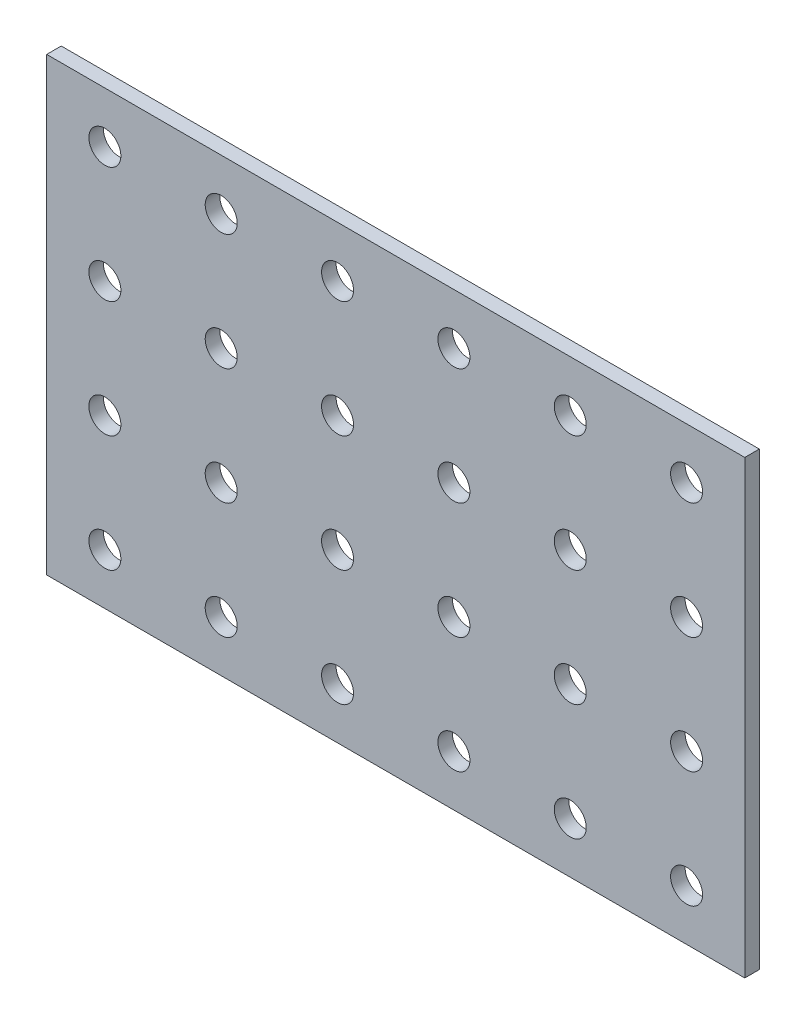
ISO-10303-21;
HEADER;
FILE_DESCRIPTION(('STEP AP214'),'2;1');
FILE_NAME('part.step','',(''),(''),'','','');
FILE_SCHEMA(('AUTOMOTIVE_DESIGN { 1 0 10303 214 1 1 1 1 }'));
ENDSEC;
DATA;
#1=APPLICATION_CONTEXT('core data for automotive mechanical design processes');
#2=APPLICATION_PROTOCOL_DEFINITION('international standard','automotive_design',2000,#1);
#3=PRODUCT_CONTEXT('',#1,'mechanical');
#4=PRODUCT('Part','Part','',(#3));
#5=PRODUCT_RELATED_PRODUCT_CATEGORY('part','',(#4));
#6=PRODUCT_DEFINITION_FORMATION('','',#4);
#7=PRODUCT_DEFINITION_CONTEXT('part definition',#1,'design');
#8=PRODUCT_DEFINITION('design','',#6,#7);
#9=PRODUCT_DEFINITION_SHAPE('','',#8);
#10=(LENGTH_UNIT() NAMED_UNIT(*) SI_UNIT(.MILLI.,.METRE.));
#11=(NAMED_UNIT(*) PLANE_ANGLE_UNIT() SI_UNIT($,.RADIAN.));
#12=(NAMED_UNIT(*) SI_UNIT($,.STERADIAN.) SOLID_ANGLE_UNIT());
#13=UNCERTAINTY_MEASURE_WITH_UNIT(LENGTH_MEASURE(1.E-05),#10,'distance_accuracy_value','');
#14=(GEOMETRIC_REPRESENTATION_CONTEXT(3) GLOBAL_UNCERTAINTY_ASSIGNED_CONTEXT((#13)) GLOBAL_UNIT_ASSIGNED_CONTEXT((#10,
#11,#12)) REPRESENTATION_CONTEXT('',''));
#15=CARTESIAN_POINT('',(0.,0.,0.));
#16=DIRECTION('',(0.,0.,1.));
#17=DIRECTION('',(1.,0.,0.));
#18=AXIS2_PLACEMENT_3D('',#15,#16,#17);
#19=CARTESIAN_POINT('',(0.,0.,10.));
#20=DIRECTION('',(1.,0.,0.));
#21=DIRECTION('',(0.,0.,-1.));
#22=AXIS2_PLACEMENT_3D('',#19,#20,#21);
#23=PLANE('',#22);
#24=DIRECTION('',(0.,-1.,0.));
#25=VECTOR('',#24,1.);
#26=CARTESIAN_POINT('',(0.,0.,0.));
#27=LINE('',#26,#25);
#28=CARTESIAN_POINT('',(0.,310.,0.));
#29=VERTEX_POINT('',#28);
#30=CARTESIAN_POINT('',(0.,0.,0.));
#31=VERTEX_POINT('',#30);
#32=EDGE_CURVE('E103',#29,#31,#27,.T.);
#33=ORIENTED_EDGE('',*,*,#32,.T.);
#34=DIRECTION('',(0.,0.,-1.));
#35=VECTOR('',#34,1.);
#36=CARTESIAN_POINT('',(0.,0.,10.));
#37=LINE('',#36,#35);
#38=CARTESIAN_POINT('',(0.,0.,10.));
#39=VERTEX_POINT('',#38);
#40=EDGE_CURVE('E94',#39,#31,#37,.T.);
#41=ORIENTED_EDGE('',*,*,#40,.F.);
#42=DIRECTION('',(0.,-1.,0.));
#43=VECTOR('',#42,1.);
#44=CARTESIAN_POINT('',(0.,0.,10.));
#45=LINE('',#44,#43);
#46=CARTESIAN_POINT('',(0.,310.,10.));
#47=VERTEX_POINT('',#46);
#48=EDGE_CURVE('E88',#47,#39,#45,.T.);
#49=ORIENTED_EDGE('',*,*,#48,.F.);
#50=DIRECTION('',(0.,0.,-1.));
#51=VECTOR('',#50,1.);
#52=CARTESIAN_POINT('',(0.,310.,10.));
#53=LINE('',#52,#51);
#54=EDGE_CURVE('E99',#47,#29,#53,.T.);
#55=ORIENTED_EDGE('',*,*,#54,.T.);
#56=EDGE_LOOP('',(#33,#41,#49,#55));
#57=FACE_BOUND('',#56,.T.);
#58=ADVANCED_FACE('F34',(#57),#23,.F.);
#59=CARTESIAN_POINT('',(0.,0.,10.));
#60=DIRECTION('',(0.,1.,0.));
#61=DIRECTION('',(0.,0.,1.));
#62=AXIS2_PLACEMENT_3D('',#59,#60,#61);
#63=PLANE('',#62);
#64=DIRECTION('',(1.,0.,0.));
#65=VECTOR('',#64,1.);
#66=CARTESIAN_POINT('',(0.,0.,0.));
#67=LINE('',#66,#65);
#68=CARTESIAN_POINT('',(480.,0.,0.));
#69=VERTEX_POINT('',#68);
#70=EDGE_CURVE('E93',#31,#69,#67,.T.);
#71=ORIENTED_EDGE('',*,*,#70,.T.);
#72=DIRECTION('',(0.,0.,-1.));
#73=VECTOR('',#72,1.);
#74=CARTESIAN_POINT('',(480.,0.,10.));
#75=LINE('',#74,#73);
#76=CARTESIAN_POINT('',(480.,0.,10.));
#77=VERTEX_POINT('',#76);
#78=EDGE_CURVE('E91',#77,#69,#75,.T.);
#79=ORIENTED_EDGE('',*,*,#78,.F.);
#80=DIRECTION('',(1.,0.,0.));
#81=VECTOR('',#80,1.);
#82=CARTESIAN_POINT('',(0.,0.,10.));
#83=LINE('',#82,#81);
#84=EDGE_CURVE('E82',#39,#77,#83,.T.);
#85=ORIENTED_EDGE('',*,*,#84,.F.);
#86=ORIENTED_EDGE('',*,*,#40,.T.);
#87=EDGE_LOOP('',(#71,#79,#85,#86));
#88=FACE_BOUND('',#87,.T.);
#89=ADVANCED_FACE('F92',(#88),#63,.F.);
#90=CARTESIAN_POINT('',(480.,0.,10.));
#91=DIRECTION('',(-1.,0.,0.));
#92=DIRECTION('',(0.,0.,1.));
#93=AXIS2_PLACEMENT_3D('',#90,#91,#92);
#94=PLANE('',#93);
#95=DIRECTION('',(0.,1.,0.));
#96=VECTOR('',#95,1.);
#97=CARTESIAN_POINT('',(480.,0.,0.));
#98=LINE('',#97,#96);
#99=CARTESIAN_POINT('',(480.,310.,0.));
#100=VERTEX_POINT('',#99);
#101=EDGE_CURVE('E68',#69,#100,#98,.T.);
#102=ORIENTED_EDGE('',*,*,#101,.T.);
#103=DIRECTION('',(0.,0.,-1.));
#104=VECTOR('',#103,1.);
#105=CARTESIAN_POINT('',(480.,310.,10.));
#106=LINE('',#105,#104);
#107=CARTESIAN_POINT('',(480.,310.,10.));
#108=VERTEX_POINT('',#107);
#109=EDGE_CURVE('E95',#108,#100,#106,.T.);
#110=ORIENTED_EDGE('',*,*,#109,.F.);
#111=DIRECTION('',(0.,1.,0.));
#112=VECTOR('',#111,1.);
#113=CARTESIAN_POINT('',(480.,0.,10.));
#114=LINE('',#113,#112);
#115=EDGE_CURVE('E86',#77,#108,#114,.T.);
#116=ORIENTED_EDGE('',*,*,#115,.F.);
#117=ORIENTED_EDGE('',*,*,#78,.T.);
#118=EDGE_LOOP('',(#102,#110,#116,#117));
#119=FACE_BOUND('',#118,.T.);
#120=ADVANCED_FACE('F97',(#119),#94,.F.);
#121=CARTESIAN_POINT('',(0.,310.,10.));
#122=DIRECTION('',(0.,-1.,0.));
#123=DIRECTION('',(0.,0.,-1.));
#124=AXIS2_PLACEMENT_3D('',#121,#122,#123);
#125=PLANE('',#124);
#126=DIRECTION('',(-1.,0.,0.));
#127=VECTOR('',#126,1.);
#128=CARTESIAN_POINT('',(0.,310.,0.));
#129=LINE('',#128,#127);
#130=EDGE_CURVE('E74',#100,#29,#129,.T.);
#131=ORIENTED_EDGE('',*,*,#130,.T.);
#132=ORIENTED_EDGE('',*,*,#54,.F.);
#133=DIRECTION('',(-1.,0.,0.));
#134=VECTOR('',#133,1.);
#135=CARTESIAN_POINT('',(0.,310.,10.));
#136=LINE('',#135,#134);
#137=EDGE_CURVE('E51',#108,#47,#136,.T.);
#138=ORIENTED_EDGE('',*,*,#137,.F.);
#139=ORIENTED_EDGE('',*,*,#109,.T.);
#140=EDGE_LOOP('',(#131,#132,#138,#139));
#141=FACE_BOUND('',#140,.T.);
#142=ADVANCED_FACE('F249',(#141),#125,.F.);
#143=CARTESIAN_POINT('',(0.,310.,10.));
#144=DIRECTION('',(0.,0.,-1.));
#145=DIRECTION('',(-1.,0.,0.));
#146=AXIS2_PLACEMENT_3D('',#143,#144,#145);
#147=PLANE('',#146);
#148=CARTESIAN_POINT('',(120.,35.,10.));
#149=DIRECTION('',(0.,0.,1.));
#150=DIRECTION('',(1.,0.,0.));
#151=AXIS2_PLACEMENT_3D('',#148,#149,#150);
#152=CIRCLE('',#151,11.);
#153=CARTESIAN_POINT('',(131.,35.,10.));
#154=VERTEX_POINT('',#153);
#155=EDGE_CURVE('E547',#154,#154,#152,.T.);
#156=ORIENTED_EDGE('',*,*,#155,.F.);
#157=EDGE_LOOP('',(#156));
#158=FACE_BOUND('',#157,.T.);
#159=CARTESIAN_POINT('',(40.,35.,10.));
#160=DIRECTION('',(0.,0.,1.));
#161=DIRECTION('',(1.,0.,0.));
#162=AXIS2_PLACEMENT_3D('',#159,#160,#161);
#163=CIRCLE('',#162,11.);
#164=CARTESIAN_POINT('',(51.,35.,10.));
#165=VERTEX_POINT('',#164);
#166=EDGE_CURVE('E546',#165,#165,#163,.T.);
#167=ORIENTED_EDGE('',*,*,#166,.F.);
#168=EDGE_LOOP('',(#167));
#169=FACE_BOUND('',#168,.T.);
#170=ORIENTED_EDGE('',*,*,#48,.T.);
#171=ORIENTED_EDGE('',*,*,#84,.T.);
#172=ORIENTED_EDGE('',*,*,#115,.T.);
#173=ORIENTED_EDGE('',*,*,#137,.T.);
#174=EDGE_LOOP('',(#170,#171,#172,#173));
#175=FACE_BOUND('',#174,.T.);
#176=CARTESIAN_POINT('',(200.,35.,10.));
#177=DIRECTION('',(0.,0.,1.));
#178=DIRECTION('',(1.,0.,0.));
#179=AXIS2_PLACEMENT_3D('',#176,#177,#178);
#180=CIRCLE('',#179,11.);
#181=CARTESIAN_POINT('',(211.,35.,10.));
#182=VERTEX_POINT('',#181);
#183=EDGE_CURVE('E116',#182,#182,#180,.T.);
#184=ORIENTED_EDGE('',*,*,#183,.F.);
#185=EDGE_LOOP('',(#184));
#186=FACE_BOUND('',#185,.T.);
#187=CARTESIAN_POINT('',(280.,35.,10.));
#188=DIRECTION('',(0.,0.,1.));
#189=DIRECTION('',(1.,0.,0.));
#190=AXIS2_PLACEMENT_3D('',#187,#188,#189);
#191=CIRCLE('',#190,11.);
#192=CARTESIAN_POINT('',(291.,35.,10.));
#193=VERTEX_POINT('',#192);
#194=EDGE_CURVE('E122',#193,#193,#191,.T.);
#195=ORIENTED_EDGE('',*,*,#194,.F.);
#196=EDGE_LOOP('',(#195));
#197=FACE_BOUND('',#196,.T.);
#198=CARTESIAN_POINT('',(360.,35.,10.));
#199=DIRECTION('',(0.,0.,1.));
#200=DIRECTION('',(1.,0.,0.));
#201=AXIS2_PLACEMENT_3D('',#198,#199,#200);
#202=CIRCLE('',#201,11.);
#203=CARTESIAN_POINT('',(371.,35.,10.));
#204=VERTEX_POINT('',#203);
#205=EDGE_CURVE('E128',#204,#204,#202,.T.);
#206=ORIENTED_EDGE('',*,*,#205,.F.);
#207=EDGE_LOOP('',(#206));
#208=FACE_BOUND('',#207,.T.);
#209=CARTESIAN_POINT('',(440.,35.,10.));
#210=DIRECTION('',(0.,0.,1.));
#211=DIRECTION('',(1.,0.,0.));
#212=AXIS2_PLACEMENT_3D('',#209,#210,#211);
#213=CIRCLE('',#212,11.);
#214=CARTESIAN_POINT('',(451.,35.,10.));
#215=VERTEX_POINT('',#214);
#216=EDGE_CURVE('E134',#215,#215,#213,.T.);
#217=ORIENTED_EDGE('',*,*,#216,.F.);
#218=EDGE_LOOP('',(#217));
#219=FACE_BOUND('',#218,.T.);
#220=CARTESIAN_POINT('',(40.,115.,10.));
#221=DIRECTION('',(0.,0.,1.));
#222=DIRECTION('',(1.,0.,0.));
#223=AXIS2_PLACEMENT_3D('',#220,#221,#222);
#224=CIRCLE('',#223,11.);
#225=CARTESIAN_POINT('',(51.,115.,10.));
#226=VERTEX_POINT('',#225);
#227=EDGE_CURVE('E140',#226,#226,#224,.T.);
#228=ORIENTED_EDGE('',*,*,#227,.F.);
#229=EDGE_LOOP('',(#228));
#230=FACE_BOUND('',#229,.T.);
#231=CARTESIAN_POINT('',(120.,115.,10.));
#232=DIRECTION('',(0.,0.,1.));
#233=DIRECTION('',(1.,0.,0.));
#234=AXIS2_PLACEMENT_3D('',#231,#232,#233);
#235=CIRCLE('',#234,11.);
#236=CARTESIAN_POINT('',(131.,115.,10.));
#237=VERTEX_POINT('',#236);
#238=EDGE_CURVE('E146',#237,#237,#235,.T.);
#239=ORIENTED_EDGE('',*,*,#238,.F.);
#240=EDGE_LOOP('',(#239));
#241=FACE_BOUND('',#240,.T.);
#242=CARTESIAN_POINT('',(200.,115.,10.));
#243=DIRECTION('',(0.,0.,1.));
#244=DIRECTION('',(1.,0.,0.));
#245=AXIS2_PLACEMENT_3D('',#242,#243,#244);
#246=CIRCLE('',#245,11.);
#247=CARTESIAN_POINT('',(211.,115.,10.));
#248=VERTEX_POINT('',#247);
#249=EDGE_CURVE('E152',#248,#248,#246,.T.);
#250=ORIENTED_EDGE('',*,*,#249,.F.);
#251=EDGE_LOOP('',(#250));
#252=FACE_BOUND('',#251,.T.);
#253=CARTESIAN_POINT('',(280.,115.,10.));
#254=DIRECTION('',(0.,0.,1.));
#255=DIRECTION('',(1.,0.,0.));
#256=AXIS2_PLACEMENT_3D('',#253,#254,#255);
#257=CIRCLE('',#256,11.);
#258=CARTESIAN_POINT('',(291.,115.,10.));
#259=VERTEX_POINT('',#258);
#260=EDGE_CURVE('E158',#259,#259,#257,.T.);
#261=ORIENTED_EDGE('',*,*,#260,.F.);
#262=EDGE_LOOP('',(#261));
#263=FACE_BOUND('',#262,.T.);
#264=CARTESIAN_POINT('',(360.,115.,10.));
#265=DIRECTION('',(0.,0.,1.));
#266=DIRECTION('',(1.,0.,0.));
#267=AXIS2_PLACEMENT_3D('',#264,#265,#266);
#268=CIRCLE('',#267,11.);
#269=CARTESIAN_POINT('',(371.,115.,10.));
#270=VERTEX_POINT('',#269);
#271=EDGE_CURVE('E164',#270,#270,#268,.T.);
#272=ORIENTED_EDGE('',*,*,#271,.F.);
#273=EDGE_LOOP('',(#272));
#274=FACE_BOUND('',#273,.T.);
#275=CARTESIAN_POINT('',(440.,115.,10.));
#276=DIRECTION('',(0.,0.,1.));
#277=DIRECTION('',(1.,0.,0.));
#278=AXIS2_PLACEMENT_3D('',#275,#276,#277);
#279=CIRCLE('',#278,11.);
#280=CARTESIAN_POINT('',(451.,115.,10.));
#281=VERTEX_POINT('',#280);
#282=EDGE_CURVE('E170',#281,#281,#279,.T.);
#283=ORIENTED_EDGE('',*,*,#282,.F.);
#284=EDGE_LOOP('',(#283));
#285=FACE_BOUND('',#284,.T.);
#286=CARTESIAN_POINT('',(40.,195.,10.));
#287=DIRECTION('',(0.,0.,1.));
#288=DIRECTION('',(1.,0.,0.));
#289=AXIS2_PLACEMENT_3D('',#286,#287,#288);
#290=CIRCLE('',#289,11.);
#291=CARTESIAN_POINT('',(51.,195.,10.));
#292=VERTEX_POINT('',#291);
#293=EDGE_CURVE('E176',#292,#292,#290,.T.);
#294=ORIENTED_EDGE('',*,*,#293,.F.);
#295=EDGE_LOOP('',(#294));
#296=FACE_BOUND('',#295,.T.);
#297=CARTESIAN_POINT('',(120.,195.,10.));
#298=DIRECTION('',(0.,0.,1.));
#299=DIRECTION('',(1.,0.,0.));
#300=AXIS2_PLACEMENT_3D('',#297,#298,#299);
#301=CIRCLE('',#300,11.);
#302=CARTESIAN_POINT('',(131.,195.,10.));
#303=VERTEX_POINT('',#302);
#304=EDGE_CURVE('E182',#303,#303,#301,.T.);
#305=ORIENTED_EDGE('',*,*,#304,.F.);
#306=EDGE_LOOP('',(#305));
#307=FACE_BOUND('',#306,.T.);
#308=CARTESIAN_POINT('',(200.,195.,10.));
#309=DIRECTION('',(0.,0.,1.));
#310=DIRECTION('',(1.,0.,0.));
#311=AXIS2_PLACEMENT_3D('',#308,#309,#310);
#312=CIRCLE('',#311,11.);
#313=CARTESIAN_POINT('',(211.,195.,10.));
#314=VERTEX_POINT('',#313);
#315=EDGE_CURVE('E188',#314,#314,#312,.T.);
#316=ORIENTED_EDGE('',*,*,#315,.F.);
#317=EDGE_LOOP('',(#316));
#318=FACE_BOUND('',#317,.T.);
#319=CARTESIAN_POINT('',(280.,195.,10.));
#320=DIRECTION('',(0.,0.,1.));
#321=DIRECTION('',(1.,0.,0.));
#322=AXIS2_PLACEMENT_3D('',#319,#320,#321);
#323=CIRCLE('',#322,11.);
#324=CARTESIAN_POINT('',(291.,195.,10.));
#325=VERTEX_POINT('',#324);
#326=EDGE_CURVE('E194',#325,#325,#323,.T.);
#327=ORIENTED_EDGE('',*,*,#326,.F.);
#328=EDGE_LOOP('',(#327));
#329=FACE_BOUND('',#328,.T.);
#330=CARTESIAN_POINT('',(360.,195.,10.));
#331=DIRECTION('',(0.,0.,1.));
#332=DIRECTION('',(1.,0.,0.));
#333=AXIS2_PLACEMENT_3D('',#330,#331,#332);
#334=CIRCLE('',#333,11.);
#335=CARTESIAN_POINT('',(371.,195.,10.));
#336=VERTEX_POINT('',#335);
#337=EDGE_CURVE('E200',#336,#336,#334,.T.);
#338=ORIENTED_EDGE('',*,*,#337,.F.);
#339=EDGE_LOOP('',(#338));
#340=FACE_BOUND('',#339,.T.);
#341=CARTESIAN_POINT('',(440.,195.,10.));
#342=DIRECTION('',(0.,0.,1.));
#343=DIRECTION('',(1.,0.,0.));
#344=AXIS2_PLACEMENT_3D('',#341,#342,#343);
#345=CIRCLE('',#344,11.);
#346=CARTESIAN_POINT('',(451.,195.,10.));
#347=VERTEX_POINT('',#346);
#348=EDGE_CURVE('E206',#347,#347,#345,.T.);
#349=ORIENTED_EDGE('',*,*,#348,.F.);
#350=EDGE_LOOP('',(#349));
#351=FACE_BOUND('',#350,.T.);
#352=CARTESIAN_POINT('',(40.,275.,10.));
#353=DIRECTION('',(0.,0.,1.));
#354=DIRECTION('',(1.,0.,0.));
#355=AXIS2_PLACEMENT_3D('',#352,#353,#354);
#356=CIRCLE('',#355,11.);
#357=CARTESIAN_POINT('',(51.,275.,10.));
#358=VERTEX_POINT('',#357);
#359=EDGE_CURVE('E212',#358,#358,#356,.T.);
#360=ORIENTED_EDGE('',*,*,#359,.F.);
#361=EDGE_LOOP('',(#360));
#362=FACE_BOUND('',#361,.T.);
#363=CARTESIAN_POINT('',(120.,275.,10.));
#364=DIRECTION('',(0.,0.,1.));
#365=DIRECTION('',(1.,0.,0.));
#366=AXIS2_PLACEMENT_3D('',#363,#364,#365);
#367=CIRCLE('',#366,11.);
#368=CARTESIAN_POINT('',(131.,275.,10.));
#369=VERTEX_POINT('',#368);
#370=EDGE_CURVE('E218',#369,#369,#367,.T.);
#371=ORIENTED_EDGE('',*,*,#370,.F.);
#372=EDGE_LOOP('',(#371));
#373=FACE_BOUND('',#372,.T.);
#374=CARTESIAN_POINT('',(200.,275.,10.));
#375=DIRECTION('',(0.,0.,1.));
#376=DIRECTION('',(1.,0.,0.));
#377=AXIS2_PLACEMENT_3D('',#374,#375,#376);
#378=CIRCLE('',#377,11.);
#379=CARTESIAN_POINT('',(211.,275.,10.));
#380=VERTEX_POINT('',#379);
#381=EDGE_CURVE('E224',#380,#380,#378,.T.);
#382=ORIENTED_EDGE('',*,*,#381,.F.);
#383=EDGE_LOOP('',(#382));
#384=FACE_BOUND('',#383,.T.);
#385=CARTESIAN_POINT('',(280.,275.,10.));
#386=DIRECTION('',(0.,0.,1.));
#387=DIRECTION('',(1.,0.,0.));
#388=AXIS2_PLACEMENT_3D('',#385,#386,#387);
#389=CIRCLE('',#388,11.);
#390=CARTESIAN_POINT('',(291.,275.,10.));
#391=VERTEX_POINT('',#390);
#392=EDGE_CURVE('E230',#391,#391,#389,.T.);
#393=ORIENTED_EDGE('',*,*,#392,.F.);
#394=EDGE_LOOP('',(#393));
#395=FACE_BOUND('',#394,.T.);
#396=CARTESIAN_POINT('',(360.,275.,10.));
#397=DIRECTION('',(0.,0.,1.));
#398=DIRECTION('',(1.,0.,0.));
#399=AXIS2_PLACEMENT_3D('',#396,#397,#398);
#400=CIRCLE('',#399,11.);
#401=CARTESIAN_POINT('',(371.,275.,10.));
#402=VERTEX_POINT('',#401);
#403=EDGE_CURVE('E236',#402,#402,#400,.T.);
#404=ORIENTED_EDGE('',*,*,#403,.F.);
#405=EDGE_LOOP('',(#404));
#406=FACE_BOUND('',#405,.T.);
#407=CARTESIAN_POINT('',(440.,275.,10.));
#408=DIRECTION('',(0.,0.,1.));
#409=DIRECTION('',(1.,0.,0.));
#410=AXIS2_PLACEMENT_3D('',#407,#408,#409);
#411=CIRCLE('',#410,11.);
#412=CARTESIAN_POINT('',(451.,275.,10.));
#413=VERTEX_POINT('',#412);
#414=EDGE_CURVE('E11',#413,#413,#411,.T.);
#415=ORIENTED_EDGE('',*,*,#414,.F.);
#416=EDGE_LOOP('',(#415));
#417=FACE_BOUND('',#416,.T.);
#418=ADVANCED_FACE('F83',(#158,#169,#175,#186,#197,#208,#219,#230,#241,#252,#263,#274,#285,#296,
#307,#318,#329,#340,#351,#362,#373,#384,#395,#406,#417),#147,.F.);
#419=CARTESIAN_POINT('',(0.,310.,0.));
#420=DIRECTION('',(0.,0.,-1.));
#421=DIRECTION('',(-1.,0.,0.));
#422=AXIS2_PLACEMENT_3D('',#419,#420,#421);
#423=PLANE('',#422);
#424=CARTESIAN_POINT('',(120.,35.,0.));
#425=DIRECTION('',(0.,0.,1.));
#426=DIRECTION('',(1.,0.,0.));
#427=AXIS2_PLACEMENT_3D('',#424,#425,#426);
#428=CIRCLE('',#427,11.);
#429=CARTESIAN_POINT('',(131.,35.,0.));
#430=VERTEX_POINT('',#429);
#431=EDGE_CURVE('E551',#430,#430,#428,.T.);
#432=ORIENTED_EDGE('',*,*,#431,.T.);
#433=EDGE_LOOP('',(#432));
#434=FACE_BOUND('',#433,.T.);
#435=CARTESIAN_POINT('',(40.,35.,0.));
#436=DIRECTION('',(0.,0.,1.));
#437=DIRECTION('',(1.,0.,0.));
#438=AXIS2_PLACEMENT_3D('',#435,#436,#437);
#439=CIRCLE('',#438,11.);
#440=CARTESIAN_POINT('',(51.,35.,0.));
#441=VERTEX_POINT('',#440);
#442=EDGE_CURVE('E106',#441,#441,#439,.T.);
#443=ORIENTED_EDGE('',*,*,#442,.T.);
#444=EDGE_LOOP('',(#443));
#445=FACE_BOUND('',#444,.T.);
#446=ORIENTED_EDGE('',*,*,#32,.F.);
#447=ORIENTED_EDGE('',*,*,#130,.F.);
#448=ORIENTED_EDGE('',*,*,#101,.F.);
#449=ORIENTED_EDGE('',*,*,#70,.F.);
#450=EDGE_LOOP('',(#446,#447,#448,#449));
#451=FACE_BOUND('',#450,.T.);
#452=CARTESIAN_POINT('',(200.,35.,0.));
#453=DIRECTION('',(0.,0.,1.));
#454=DIRECTION('',(1.,0.,0.));
#455=AXIS2_PLACEMENT_3D('',#452,#453,#454);
#456=CIRCLE('',#455,11.);
#457=CARTESIAN_POINT('',(211.,35.,0.));
#458=VERTEX_POINT('',#457);
#459=EDGE_CURVE('E113',#458,#458,#456,.T.);
#460=ORIENTED_EDGE('',*,*,#459,.T.);
#461=EDGE_LOOP('',(#460));
#462=FACE_BOUND('',#461,.T.);
#463=CARTESIAN_POINT('',(280.,35.,0.));
#464=DIRECTION('',(0.,0.,1.));
#465=DIRECTION('',(1.,0.,0.));
#466=AXIS2_PLACEMENT_3D('',#463,#464,#465);
#467=CIRCLE('',#466,11.);
#468=CARTESIAN_POINT('',(291.,35.,0.));
#469=VERTEX_POINT('',#468);
#470=EDGE_CURVE('E119',#469,#469,#467,.T.);
#471=ORIENTED_EDGE('',*,*,#470,.T.);
#472=EDGE_LOOP('',(#471));
#473=FACE_BOUND('',#472,.T.);
#474=CARTESIAN_POINT('',(360.,35.,0.));
#475=DIRECTION('',(0.,0.,1.));
#476=DIRECTION('',(1.,0.,0.));
#477=AXIS2_PLACEMENT_3D('',#474,#475,#476);
#478=CIRCLE('',#477,11.);
#479=CARTESIAN_POINT('',(371.,35.,0.));
#480=VERTEX_POINT('',#479);
#481=EDGE_CURVE('E125',#480,#480,#478,.T.);
#482=ORIENTED_EDGE('',*,*,#481,.T.);
#483=EDGE_LOOP('',(#482));
#484=FACE_BOUND('',#483,.T.);
#485=CARTESIAN_POINT('',(440.,35.,0.));
#486=DIRECTION('',(0.,0.,1.));
#487=DIRECTION('',(1.,0.,0.));
#488=AXIS2_PLACEMENT_3D('',#485,#486,#487);
#489=CIRCLE('',#488,11.);
#490=CARTESIAN_POINT('',(451.,35.,0.));
#491=VERTEX_POINT('',#490);
#492=EDGE_CURVE('E131',#491,#491,#489,.T.);
#493=ORIENTED_EDGE('',*,*,#492,.T.);
#494=EDGE_LOOP('',(#493));
#495=FACE_BOUND('',#494,.T.);
#496=CARTESIAN_POINT('',(40.,115.,0.));
#497=DIRECTION('',(0.,0.,1.));
#498=DIRECTION('',(1.,0.,0.));
#499=AXIS2_PLACEMENT_3D('',#496,#497,#498);
#500=CIRCLE('',#499,11.);
#501=CARTESIAN_POINT('',(51.,115.,0.));
#502=VERTEX_POINT('',#501);
#503=EDGE_CURVE('E137',#502,#502,#500,.T.);
#504=ORIENTED_EDGE('',*,*,#503,.T.);
#505=EDGE_LOOP('',(#504));
#506=FACE_BOUND('',#505,.T.);
#507=CARTESIAN_POINT('',(120.,115.,0.));
#508=DIRECTION('',(0.,0.,1.));
#509=DIRECTION('',(1.,0.,0.));
#510=AXIS2_PLACEMENT_3D('',#507,#508,#509);
#511=CIRCLE('',#510,11.);
#512=CARTESIAN_POINT('',(131.,115.,0.));
#513=VERTEX_POINT('',#512);
#514=EDGE_CURVE('E143',#513,#513,#511,.T.);
#515=ORIENTED_EDGE('',*,*,#514,.T.);
#516=EDGE_LOOP('',(#515));
#517=FACE_BOUND('',#516,.T.);
#518=CARTESIAN_POINT('',(200.,115.,0.));
#519=DIRECTION('',(0.,0.,1.));
#520=DIRECTION('',(1.,0.,0.));
#521=AXIS2_PLACEMENT_3D('',#518,#519,#520);
#522=CIRCLE('',#521,11.);
#523=CARTESIAN_POINT('',(211.,115.,0.));
#524=VERTEX_POINT('',#523);
#525=EDGE_CURVE('E149',#524,#524,#522,.T.);
#526=ORIENTED_EDGE('',*,*,#525,.T.);
#527=EDGE_LOOP('',(#526));
#528=FACE_BOUND('',#527,.T.);
#529=CARTESIAN_POINT('',(280.,115.,0.));
#530=DIRECTION('',(0.,0.,1.));
#531=DIRECTION('',(1.,0.,0.));
#532=AXIS2_PLACEMENT_3D('',#529,#530,#531);
#533=CIRCLE('',#532,11.);
#534=CARTESIAN_POINT('',(291.,115.,0.));
#535=VERTEX_POINT('',#534);
#536=EDGE_CURVE('E155',#535,#535,#533,.T.);
#537=ORIENTED_EDGE('',*,*,#536,.T.);
#538=EDGE_LOOP('',(#537));
#539=FACE_BOUND('',#538,.T.);
#540=CARTESIAN_POINT('',(360.,115.,0.));
#541=DIRECTION('',(0.,0.,1.));
#542=DIRECTION('',(1.,0.,0.));
#543=AXIS2_PLACEMENT_3D('',#540,#541,#542);
#544=CIRCLE('',#543,11.);
#545=CARTESIAN_POINT('',(371.,115.,0.));
#546=VERTEX_POINT('',#545);
#547=EDGE_CURVE('E161',#546,#546,#544,.T.);
#548=ORIENTED_EDGE('',*,*,#547,.T.);
#549=EDGE_LOOP('',(#548));
#550=FACE_BOUND('',#549,.T.);
#551=CARTESIAN_POINT('',(440.,115.,0.));
#552=DIRECTION('',(0.,0.,1.));
#553=DIRECTION('',(1.,0.,0.));
#554=AXIS2_PLACEMENT_3D('',#551,#552,#553);
#555=CIRCLE('',#554,11.);
#556=CARTESIAN_POINT('',(451.,115.,0.));
#557=VERTEX_POINT('',#556);
#558=EDGE_CURVE('E167',#557,#557,#555,.T.);
#559=ORIENTED_EDGE('',*,*,#558,.T.);
#560=EDGE_LOOP('',(#559));
#561=FACE_BOUND('',#560,.T.);
#562=CARTESIAN_POINT('',(40.,195.,0.));
#563=DIRECTION('',(0.,0.,1.));
#564=DIRECTION('',(1.,0.,0.));
#565=AXIS2_PLACEMENT_3D('',#562,#563,#564);
#566=CIRCLE('',#565,11.);
#567=CARTESIAN_POINT('',(51.,195.,0.));
#568=VERTEX_POINT('',#567);
#569=EDGE_CURVE('E173',#568,#568,#566,.T.);
#570=ORIENTED_EDGE('',*,*,#569,.T.);
#571=EDGE_LOOP('',(#570));
#572=FACE_BOUND('',#571,.T.);
#573=CARTESIAN_POINT('',(120.,195.,0.));
#574=DIRECTION('',(0.,0.,1.));
#575=DIRECTION('',(1.,0.,0.));
#576=AXIS2_PLACEMENT_3D('',#573,#574,#575);
#577=CIRCLE('',#576,11.);
#578=CARTESIAN_POINT('',(131.,195.,0.));
#579=VERTEX_POINT('',#578);
#580=EDGE_CURVE('E179',#579,#579,#577,.T.);
#581=ORIENTED_EDGE('',*,*,#580,.T.);
#582=EDGE_LOOP('',(#581));
#583=FACE_BOUND('',#582,.T.);
#584=CARTESIAN_POINT('',(200.,195.,0.));
#585=DIRECTION('',(0.,0.,1.));
#586=DIRECTION('',(1.,0.,0.));
#587=AXIS2_PLACEMENT_3D('',#584,#585,#586);
#588=CIRCLE('',#587,11.);
#589=CARTESIAN_POINT('',(211.,195.,0.));
#590=VERTEX_POINT('',#589);
#591=EDGE_CURVE('E185',#590,#590,#588,.T.);
#592=ORIENTED_EDGE('',*,*,#591,.T.);
#593=EDGE_LOOP('',(#592));
#594=FACE_BOUND('',#593,.T.);
#595=CARTESIAN_POINT('',(280.,195.,0.));
#596=DIRECTION('',(0.,0.,1.));
#597=DIRECTION('',(1.,0.,0.));
#598=AXIS2_PLACEMENT_3D('',#595,#596,#597);
#599=CIRCLE('',#598,11.);
#600=CARTESIAN_POINT('',(291.,195.,0.));
#601=VERTEX_POINT('',#600);
#602=EDGE_CURVE('E191',#601,#601,#599,.T.);
#603=ORIENTED_EDGE('',*,*,#602,.T.);
#604=EDGE_LOOP('',(#603));
#605=FACE_BOUND('',#604,.T.);
#606=CARTESIAN_POINT('',(360.,195.,0.));
#607=DIRECTION('',(0.,0.,1.));
#608=DIRECTION('',(1.,0.,0.));
#609=AXIS2_PLACEMENT_3D('',#606,#607,#608);
#610=CIRCLE('',#609,11.);
#611=CARTESIAN_POINT('',(371.,195.,0.));
#612=VERTEX_POINT('',#611);
#613=EDGE_CURVE('E197',#612,#612,#610,.T.);
#614=ORIENTED_EDGE('',*,*,#613,.T.);
#615=EDGE_LOOP('',(#614));
#616=FACE_BOUND('',#615,.T.);
#617=CARTESIAN_POINT('',(440.,195.,0.));
#618=DIRECTION('',(0.,0.,1.));
#619=DIRECTION('',(1.,0.,0.));
#620=AXIS2_PLACEMENT_3D('',#617,#618,#619);
#621=CIRCLE('',#620,11.);
#622=CARTESIAN_POINT('',(451.,195.,0.));
#623=VERTEX_POINT('',#622);
#624=EDGE_CURVE('E203',#623,#623,#621,.T.);
#625=ORIENTED_EDGE('',*,*,#624,.T.);
#626=EDGE_LOOP('',(#625));
#627=FACE_BOUND('',#626,.T.);
#628=CARTESIAN_POINT('',(40.,275.,0.));
#629=DIRECTION('',(0.,0.,1.));
#630=DIRECTION('',(1.,0.,0.));
#631=AXIS2_PLACEMENT_3D('',#628,#629,#630);
#632=CIRCLE('',#631,11.);
#633=CARTESIAN_POINT('',(51.,275.,0.));
#634=VERTEX_POINT('',#633);
#635=EDGE_CURVE('E209',#634,#634,#632,.T.);
#636=ORIENTED_EDGE('',*,*,#635,.T.);
#637=EDGE_LOOP('',(#636));
#638=FACE_BOUND('',#637,.T.);
#639=CARTESIAN_POINT('',(120.,275.,0.));
#640=DIRECTION('',(0.,0.,1.));
#641=DIRECTION('',(1.,0.,0.));
#642=AXIS2_PLACEMENT_3D('',#639,#640,#641);
#643=CIRCLE('',#642,11.);
#644=CARTESIAN_POINT('',(131.,275.,0.));
#645=VERTEX_POINT('',#644);
#646=EDGE_CURVE('E215',#645,#645,#643,.T.);
#647=ORIENTED_EDGE('',*,*,#646,.T.);
#648=EDGE_LOOP('',(#647));
#649=FACE_BOUND('',#648,.T.);
#650=CARTESIAN_POINT('',(200.,275.,0.));
#651=DIRECTION('',(0.,0.,1.));
#652=DIRECTION('',(1.,0.,0.));
#653=AXIS2_PLACEMENT_3D('',#650,#651,#652);
#654=CIRCLE('',#653,11.);
#655=CARTESIAN_POINT('',(211.,275.,0.));
#656=VERTEX_POINT('',#655);
#657=EDGE_CURVE('E221',#656,#656,#654,.T.);
#658=ORIENTED_EDGE('',*,*,#657,.T.);
#659=EDGE_LOOP('',(#658));
#660=FACE_BOUND('',#659,.T.);
#661=CARTESIAN_POINT('',(280.,275.,0.));
#662=DIRECTION('',(0.,0.,1.));
#663=DIRECTION('',(1.,0.,0.));
#664=AXIS2_PLACEMENT_3D('',#661,#662,#663);
#665=CIRCLE('',#664,11.);
#666=CARTESIAN_POINT('',(291.,275.,0.));
#667=VERTEX_POINT('',#666);
#668=EDGE_CURVE('E227',#667,#667,#665,.T.);
#669=ORIENTED_EDGE('',*,*,#668,.T.);
#670=EDGE_LOOP('',(#669));
#671=FACE_BOUND('',#670,.T.);
#672=CARTESIAN_POINT('',(360.,275.,0.));
#673=DIRECTION('',(0.,0.,1.));
#674=DIRECTION('',(1.,0.,0.));
#675=AXIS2_PLACEMENT_3D('',#672,#673,#674);
#676=CIRCLE('',#675,11.);
#677=CARTESIAN_POINT('',(371.,275.,0.));
#678=VERTEX_POINT('',#677);
#679=EDGE_CURVE('E233',#678,#678,#676,.T.);
#680=ORIENTED_EDGE('',*,*,#679,.T.);
#681=EDGE_LOOP('',(#680));
#682=FACE_BOUND('',#681,.T.);
#683=CARTESIAN_POINT('',(440.,275.,0.));
#684=DIRECTION('',(0.,0.,1.));
#685=DIRECTION('',(1.,0.,0.));
#686=AXIS2_PLACEMENT_3D('',#683,#684,#685);
#687=CIRCLE('',#686,11.);
#688=CARTESIAN_POINT('',(451.,275.,0.));
#689=VERTEX_POINT('',#688);
#690=EDGE_CURVE('E43',#689,#689,#687,.T.);
#691=ORIENTED_EDGE('',*,*,#690,.T.);
#692=EDGE_LOOP('',(#691));
#693=FACE_BOUND('',#692,.T.);
#694=ADVANCED_FACE('F241',(#434,#445,#451,#462,#473,#484,#495,#506,#517,#528,#539,#550,#561,
#572,#583,#594,#605,#616,#627,#638,#649,#660,#671,#682,#693),#423,.T.);
#695=CARTESIAN_POINT('',(40.,35.,0.));
#696=DIRECTION('',(0.,0.,1.));
#697=DIRECTION('',(1.,0.,0.));
#698=AXIS2_PLACEMENT_3D('',#695,#696,#697);
#699=CYLINDRICAL_SURFACE('',#698,11.);
#700=ORIENTED_EDGE('',*,*,#442,.F.);
#701=EDGE_LOOP('',(#700));
#702=FACE_BOUND('',#701,.T.);
#703=ORIENTED_EDGE('',*,*,#166,.T.);
#704=EDGE_LOOP('',(#703));
#705=FACE_BOUND('',#704,.T.);
#706=ADVANCED_FACE('F256',(#702,#705),#699,.F.);
#707=CARTESIAN_POINT('',(120.,35.,0.));
#708=DIRECTION('',(0.,0.,1.));
#709=DIRECTION('',(1.,0.,0.));
#710=AXIS2_PLACEMENT_3D('',#707,#708,#709);
#711=CYLINDRICAL_SURFACE('',#710,11.);
#712=ORIENTED_EDGE('',*,*,#431,.F.);
#713=EDGE_LOOP('',(#712));
#714=FACE_BOUND('',#713,.T.);
#715=ORIENTED_EDGE('',*,*,#155,.T.);
#716=EDGE_LOOP('',(#715));
#717=FACE_BOUND('',#716,.T.);
#718=ADVANCED_FACE('F276',(#714,#717),#711,.F.);
#719=CARTESIAN_POINT('',(200.,35.,0.));
#720=DIRECTION('',(0.,0.,1.));
#721=DIRECTION('',(1.,0.,0.));
#722=AXIS2_PLACEMENT_3D('',#719,#720,#721);
#723=CYLINDRICAL_SURFACE('',#722,11.);
#724=ORIENTED_EDGE('',*,*,#459,.F.);
#725=EDGE_LOOP('',(#724));
#726=FACE_BOUND('',#725,.T.);
#727=ORIENTED_EDGE('',*,*,#183,.T.);
#728=EDGE_LOOP('',(#727));
#729=FACE_BOUND('',#728,.T.);
#730=ADVANCED_FACE('F272',(#726,#729),#723,.F.);
#731=CARTESIAN_POINT('',(280.,35.,0.));
#732=DIRECTION('',(0.,0.,1.));
#733=DIRECTION('',(1.,0.,0.));
#734=AXIS2_PLACEMENT_3D('',#731,#732,#733);
#735=CYLINDRICAL_SURFACE('',#734,11.);
#736=ORIENTED_EDGE('',*,*,#470,.F.);
#737=EDGE_LOOP('',(#736));
#738=FACE_BOUND('',#737,.T.);
#739=ORIENTED_EDGE('',*,*,#194,.T.);
#740=EDGE_LOOP('',(#739));
#741=FACE_BOUND('',#740,.T.);
#742=ADVANCED_FACE('F275',(#738,#741),#735,.F.);
#743=CARTESIAN_POINT('',(360.,35.,0.));
#744=DIRECTION('',(0.,0.,1.));
#745=DIRECTION('',(1.,0.,0.));
#746=AXIS2_PLACEMENT_3D('',#743,#744,#745);
#747=CYLINDRICAL_SURFACE('',#746,11.);
#748=ORIENTED_EDGE('',*,*,#481,.F.);
#749=EDGE_LOOP('',(#748));
#750=FACE_BOUND('',#749,.T.);
#751=ORIENTED_EDGE('',*,*,#205,.T.);
#752=EDGE_LOOP('',(#751));
#753=FACE_BOUND('',#752,.T.);
#754=ADVANCED_FACE('F280',(#750,#753),#747,.F.);
#755=CARTESIAN_POINT('',(440.,35.,0.));
#756=DIRECTION('',(0.,0.,1.));
#757=DIRECTION('',(1.,0.,0.));
#758=AXIS2_PLACEMENT_3D('',#755,#756,#757);
#759=CYLINDRICAL_SURFACE('',#758,11.);
#760=ORIENTED_EDGE('',*,*,#492,.F.);
#761=EDGE_LOOP('',(#760));
#762=FACE_BOUND('',#761,.T.);
#763=ORIENTED_EDGE('',*,*,#216,.T.);
#764=EDGE_LOOP('',(#763));
#765=FACE_BOUND('',#764,.T.);
#766=ADVANCED_FACE('F284',(#762,#765),#759,.F.);
#767=CARTESIAN_POINT('',(40.,115.,0.));
#768=DIRECTION('',(0.,0.,1.));
#769=DIRECTION('',(1.,0.,0.));
#770=AXIS2_PLACEMENT_3D('',#767,#768,#769);
#771=CYLINDRICAL_SURFACE('',#770,11.);
#772=ORIENTED_EDGE('',*,*,#503,.F.);
#773=EDGE_LOOP('',(#772));
#774=FACE_BOUND('',#773,.T.);
#775=ORIENTED_EDGE('',*,*,#227,.T.);
#776=EDGE_LOOP('',(#775));
#777=FACE_BOUND('',#776,.T.);
#778=ADVANCED_FACE('F288',(#774,#777),#771,.F.);
#779=CARTESIAN_POINT('',(120.,115.,0.));
#780=DIRECTION('',(0.,0.,1.));
#781=DIRECTION('',(1.,0.,0.));
#782=AXIS2_PLACEMENT_3D('',#779,#780,#781);
#783=CYLINDRICAL_SURFACE('',#782,11.);
#784=ORIENTED_EDGE('',*,*,#514,.F.);
#785=EDGE_LOOP('',(#784));
#786=FACE_BOUND('',#785,.T.);
#787=ORIENTED_EDGE('',*,*,#238,.T.);
#788=EDGE_LOOP('',(#787));
#789=FACE_BOUND('',#788,.T.);
#790=ADVANCED_FACE('F292',(#786,#789),#783,.F.);
#791=CARTESIAN_POINT('',(200.,115.,0.));
#792=DIRECTION('',(0.,0.,1.));
#793=DIRECTION('',(1.,0.,0.));
#794=AXIS2_PLACEMENT_3D('',#791,#792,#793);
#795=CYLINDRICAL_SURFACE('',#794,11.);
#796=ORIENTED_EDGE('',*,*,#525,.F.);
#797=EDGE_LOOP('',(#796));
#798=FACE_BOUND('',#797,.T.);
#799=ORIENTED_EDGE('',*,*,#249,.T.);
#800=EDGE_LOOP('',(#799));
#801=FACE_BOUND('',#800,.T.);
#802=ADVANCED_FACE('F296',(#798,#801),#795,.F.);
#803=CARTESIAN_POINT('',(280.,115.,0.));
#804=DIRECTION('',(0.,0.,1.));
#805=DIRECTION('',(1.,0.,0.));
#806=AXIS2_PLACEMENT_3D('',#803,#804,#805);
#807=CYLINDRICAL_SURFACE('',#806,11.);
#808=ORIENTED_EDGE('',*,*,#536,.F.);
#809=EDGE_LOOP('',(#808));
#810=FACE_BOUND('',#809,.T.);
#811=ORIENTED_EDGE('',*,*,#260,.T.);
#812=EDGE_LOOP('',(#811));
#813=FACE_BOUND('',#812,.T.);
#814=ADVANCED_FACE('F300',(#810,#813),#807,.F.);
#815=CARTESIAN_POINT('',(360.,115.,0.));
#816=DIRECTION('',(0.,0.,1.));
#817=DIRECTION('',(1.,0.,0.));
#818=AXIS2_PLACEMENT_3D('',#815,#816,#817);
#819=CYLINDRICAL_SURFACE('',#818,11.);
#820=ORIENTED_EDGE('',*,*,#547,.F.);
#821=EDGE_LOOP('',(#820));
#822=FACE_BOUND('',#821,.T.);
#823=ORIENTED_EDGE('',*,*,#271,.T.);
#824=EDGE_LOOP('',(#823));
#825=FACE_BOUND('',#824,.T.);
#826=ADVANCED_FACE('F304',(#822,#825),#819,.F.);
#827=CARTESIAN_POINT('',(440.,115.,0.));
#828=DIRECTION('',(0.,0.,1.));
#829=DIRECTION('',(1.,0.,0.));
#830=AXIS2_PLACEMENT_3D('',#827,#828,#829);
#831=CYLINDRICAL_SURFACE('',#830,11.);
#832=ORIENTED_EDGE('',*,*,#558,.F.);
#833=EDGE_LOOP('',(#832));
#834=FACE_BOUND('',#833,.T.);
#835=ORIENTED_EDGE('',*,*,#282,.T.);
#836=EDGE_LOOP('',(#835));
#837=FACE_BOUND('',#836,.T.);
#838=ADVANCED_FACE('F308',(#834,#837),#831,.F.);
#839=CARTESIAN_POINT('',(40.,195.,0.));
#840=DIRECTION('',(0.,0.,1.));
#841=DIRECTION('',(1.,0.,0.));
#842=AXIS2_PLACEMENT_3D('',#839,#840,#841);
#843=CYLINDRICAL_SURFACE('',#842,11.);
#844=ORIENTED_EDGE('',*,*,#569,.F.);
#845=EDGE_LOOP('',(#844));
#846=FACE_BOUND('',#845,.T.);
#847=ORIENTED_EDGE('',*,*,#293,.T.);
#848=EDGE_LOOP('',(#847));
#849=FACE_BOUND('',#848,.T.);
#850=ADVANCED_FACE('F312',(#846,#849),#843,.F.);
#851=CARTESIAN_POINT('',(120.,195.,0.));
#852=DIRECTION('',(0.,0.,1.));
#853=DIRECTION('',(1.,0.,0.));
#854=AXIS2_PLACEMENT_3D('',#851,#852,#853);
#855=CYLINDRICAL_SURFACE('',#854,11.);
#856=ORIENTED_EDGE('',*,*,#580,.F.);
#857=EDGE_LOOP('',(#856));
#858=FACE_BOUND('',#857,.T.);
#859=ORIENTED_EDGE('',*,*,#304,.T.);
#860=EDGE_LOOP('',(#859));
#861=FACE_BOUND('',#860,.T.);
#862=ADVANCED_FACE('F316',(#858,#861),#855,.F.);
#863=CARTESIAN_POINT('',(200.,195.,0.));
#864=DIRECTION('',(0.,0.,1.));
#865=DIRECTION('',(1.,0.,0.));
#866=AXIS2_PLACEMENT_3D('',#863,#864,#865);
#867=CYLINDRICAL_SURFACE('',#866,11.);
#868=ORIENTED_EDGE('',*,*,#591,.F.);
#869=EDGE_LOOP('',(#868));
#870=FACE_BOUND('',#869,.T.);
#871=ORIENTED_EDGE('',*,*,#315,.T.);
#872=EDGE_LOOP('',(#871));
#873=FACE_BOUND('',#872,.T.);
#874=ADVANCED_FACE('F320',(#870,#873),#867,.F.);
#875=CARTESIAN_POINT('',(280.,195.,0.));
#876=DIRECTION('',(0.,0.,1.));
#877=DIRECTION('',(1.,0.,0.));
#878=AXIS2_PLACEMENT_3D('',#875,#876,#877);
#879=CYLINDRICAL_SURFACE('',#878,11.);
#880=ORIENTED_EDGE('',*,*,#602,.F.);
#881=EDGE_LOOP('',(#880));
#882=FACE_BOUND('',#881,.T.);
#883=ORIENTED_EDGE('',*,*,#326,.T.);
#884=EDGE_LOOP('',(#883));
#885=FACE_BOUND('',#884,.T.);
#886=ADVANCED_FACE('F324',(#882,#885),#879,.F.);
#887=CARTESIAN_POINT('',(360.,195.,0.));
#888=DIRECTION('',(0.,0.,1.));
#889=DIRECTION('',(1.,0.,0.));
#890=AXIS2_PLACEMENT_3D('',#887,#888,#889);
#891=CYLINDRICAL_SURFACE('',#890,11.);
#892=ORIENTED_EDGE('',*,*,#613,.F.);
#893=EDGE_LOOP('',(#892));
#894=FACE_BOUND('',#893,.T.);
#895=ORIENTED_EDGE('',*,*,#337,.T.);
#896=EDGE_LOOP('',(#895));
#897=FACE_BOUND('',#896,.T.);
#898=ADVANCED_FACE('F328',(#894,#897),#891,.F.);
#899=CARTESIAN_POINT('',(440.,195.,0.));
#900=DIRECTION('',(0.,0.,1.));
#901=DIRECTION('',(1.,0.,0.));
#902=AXIS2_PLACEMENT_3D('',#899,#900,#901);
#903=CYLINDRICAL_SURFACE('',#902,11.);
#904=ORIENTED_EDGE('',*,*,#624,.F.);
#905=EDGE_LOOP('',(#904));
#906=FACE_BOUND('',#905,.T.);
#907=ORIENTED_EDGE('',*,*,#348,.T.);
#908=EDGE_LOOP('',(#907));
#909=FACE_BOUND('',#908,.T.);
#910=ADVANCED_FACE('F332',(#906,#909),#903,.F.);
#911=CARTESIAN_POINT('',(40.,275.,0.));
#912=DIRECTION('',(0.,0.,1.));
#913=DIRECTION('',(1.,0.,0.));
#914=AXIS2_PLACEMENT_3D('',#911,#912,#913);
#915=CYLINDRICAL_SURFACE('',#914,11.);
#916=ORIENTED_EDGE('',*,*,#635,.F.);
#917=EDGE_LOOP('',(#916));
#918=FACE_BOUND('',#917,.T.);
#919=ORIENTED_EDGE('',*,*,#359,.T.);
#920=EDGE_LOOP('',(#919));
#921=FACE_BOUND('',#920,.T.);
#922=ADVANCED_FACE('F336',(#918,#921),#915,.F.);
#923=CARTESIAN_POINT('',(120.,275.,0.));
#924=DIRECTION('',(0.,0.,1.));
#925=DIRECTION('',(1.,0.,0.));
#926=AXIS2_PLACEMENT_3D('',#923,#924,#925);
#927=CYLINDRICAL_SURFACE('',#926,11.);
#928=ORIENTED_EDGE('',*,*,#646,.F.);
#929=EDGE_LOOP('',(#928));
#930=FACE_BOUND('',#929,.T.);
#931=ORIENTED_EDGE('',*,*,#370,.T.);
#932=EDGE_LOOP('',(#931));
#933=FACE_BOUND('',#932,.T.);
#934=ADVANCED_FACE('F340',(#930,#933),#927,.F.);
#935=CARTESIAN_POINT('',(200.,275.,0.));
#936=DIRECTION('',(0.,0.,1.));
#937=DIRECTION('',(1.,0.,0.));
#938=AXIS2_PLACEMENT_3D('',#935,#936,#937);
#939=CYLINDRICAL_SURFACE('',#938,11.);
#940=ORIENTED_EDGE('',*,*,#657,.F.);
#941=EDGE_LOOP('',(#940));
#942=FACE_BOUND('',#941,.T.);
#943=ORIENTED_EDGE('',*,*,#381,.T.);
#944=EDGE_LOOP('',(#943));
#945=FACE_BOUND('',#944,.T.);
#946=ADVANCED_FACE('F344',(#942,#945),#939,.F.);
#947=CARTESIAN_POINT('',(280.,275.,0.));
#948=DIRECTION('',(0.,0.,1.));
#949=DIRECTION('',(1.,0.,0.));
#950=AXIS2_PLACEMENT_3D('',#947,#948,#949);
#951=CYLINDRICAL_SURFACE('',#950,11.);
#952=ORIENTED_EDGE('',*,*,#668,.F.);
#953=EDGE_LOOP('',(#952));
#954=FACE_BOUND('',#953,.T.);
#955=ORIENTED_EDGE('',*,*,#392,.T.);
#956=EDGE_LOOP('',(#955));
#957=FACE_BOUND('',#956,.T.);
#958=ADVANCED_FACE('F348',(#954,#957),#951,.F.);
#959=CARTESIAN_POINT('',(360.,275.,0.));
#960=DIRECTION('',(0.,0.,1.));
#961=DIRECTION('',(1.,0.,0.));
#962=AXIS2_PLACEMENT_3D('',#959,#960,#961);
#963=CYLINDRICAL_SURFACE('',#962,11.);
#964=ORIENTED_EDGE('',*,*,#679,.F.);
#965=EDGE_LOOP('',(#964));
#966=FACE_BOUND('',#965,.T.);
#967=ORIENTED_EDGE('',*,*,#403,.T.);
#968=EDGE_LOOP('',(#967));
#969=FACE_BOUND('',#968,.T.);
#970=ADVANCED_FACE('F245',(#966,#969),#963,.F.);
#971=CARTESIAN_POINT('',(440.,275.,0.));
#972=DIRECTION('',(0.,0.,1.));
#973=DIRECTION('',(1.,0.,0.));
#974=AXIS2_PLACEMENT_3D('',#971,#972,#973);
#975=CYLINDRICAL_SURFACE('',#974,11.);
#976=ORIENTED_EDGE('',*,*,#690,.F.);
#977=EDGE_LOOP('',(#976));
#978=FACE_BOUND('',#977,.T.);
#979=ORIENTED_EDGE('',*,*,#414,.T.);
#980=EDGE_LOOP('',(#979));
#981=FACE_BOUND('',#980,.T.);
#982=ADVANCED_FACE('F36',(#978,#981),#975,.F.);
#983=CLOSED_SHELL('',(#58,#89,#120,#142,#418,#694,#706,#718,#730,#742,#754,#766,#778,#790,#802,
#814,#826,#838,#850,#862,#874,#886,#898,#910,#922,#934,#946,#958,#970,#982));
#984=MANIFOLD_SOLID_BREP('B2',#983);
#985=ADVANCED_BREP_SHAPE_REPRESENTATION('',(#18,#984),#14);
#986=SHAPE_DEFINITION_REPRESENTATION(#9,#985);
ENDSEC;
END-ISO-10303-21;
